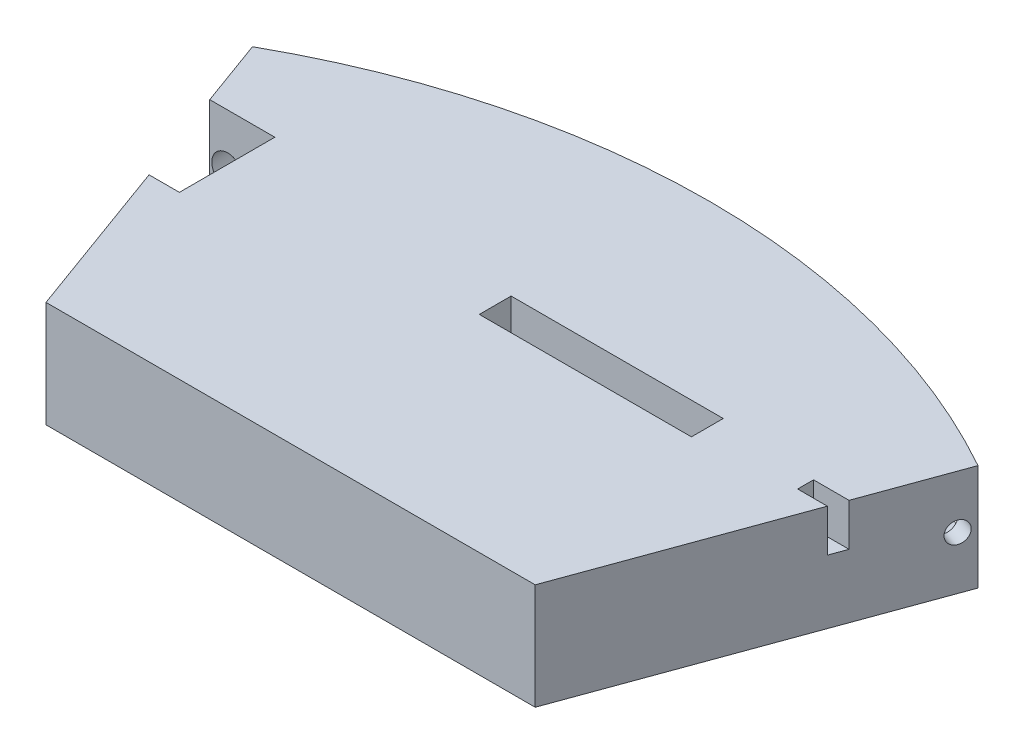
ISO-10303-21;
HEADER;
FILE_DESCRIPTION(('STEP AP214'),'2;1');
FILE_NAME('part.step','',(''),(''),'','','');
FILE_SCHEMA(('AUTOMOTIVE_DESIGN { 1 0 10303 214 1 1 1 1 }'));
ENDSEC;
DATA;
#1=APPLICATION_CONTEXT('core data for automotive mechanical design processes');
#2=APPLICATION_PROTOCOL_DEFINITION('international standard','automotive_design',2000,#1);
#3=PRODUCT_CONTEXT('',#1,'mechanical');
#4=PRODUCT('Part','Part','',(#3));
#5=PRODUCT_RELATED_PRODUCT_CATEGORY('part','',(#4));
#6=PRODUCT_DEFINITION_FORMATION('','',#4);
#7=PRODUCT_DEFINITION_CONTEXT('part definition',#1,'design');
#8=PRODUCT_DEFINITION('design','',#6,#7);
#9=PRODUCT_DEFINITION_SHAPE('','',#8);
#10=(LENGTH_UNIT() NAMED_UNIT(*) SI_UNIT(.MILLI.,.METRE.));
#11=(NAMED_UNIT(*) PLANE_ANGLE_UNIT() SI_UNIT($,.RADIAN.));
#12=(NAMED_UNIT(*) SI_UNIT($,.STERADIAN.) SOLID_ANGLE_UNIT());
#13=UNCERTAINTY_MEASURE_WITH_UNIT(LENGTH_MEASURE(1.E-05),#10,'distance_accuracy_value','');
#14=(GEOMETRIC_REPRESENTATION_CONTEXT(3) GLOBAL_UNCERTAINTY_ASSIGNED_CONTEXT((#13)) GLOBAL_UNIT_ASSIGNED_CONTEXT((#10,
#11,#12)) REPRESENTATION_CONTEXT('',''));
#15=CARTESIAN_POINT('',(0.,0.,0.));
#16=DIRECTION('',(0.,0.,1.));
#17=DIRECTION('',(1.,0.,0.));
#18=AXIS2_PLACEMENT_3D('',#15,#16,#17);
#19=CARTESIAN_POINT('',(-10.5718368385246,48.,3.84783393074178));
#20=DIRECTION('',(0.939692620785911,0.,-0.342020143325663));
#21=DIRECTION('',(-0.342020143325663,0.,-0.939692620785911));
#22=AXIS2_PLACEMENT_3D('',#19,#20,#21);
#23=PLANE('',#22);
#24=DIRECTION('',(0.,-1.,0.));
#25=VECTOR('',#24,1.);
#26=CARTESIAN_POINT('',(-23.0613730998364,48.,-30.4668849266728));
#27=LINE('',#26,#25);
#28=CARTESIAN_POINT('',(-23.0613730998364,10.,-30.4668849266728));
#29=VERTEX_POINT('',#28);
#30=CARTESIAN_POINT('',(-23.0613730998364,0.,-30.4668849266728));
#31=VERTEX_POINT('',#30);
#32=EDGE_CURVE('E54',#29,#31,#27,.T.);
#33=ORIENTED_EDGE('',*,*,#32,.F.);
#34=DIRECTION('',(-0.342020143325663,0.,-0.939692620785911));
#35=VECTOR('',#34,1.);
#36=CARTESIAN_POINT('',(-10.5718368385246,10.,3.84783393074178));
#37=LINE('',#36,#35);
#38=CARTESIAN_POINT('',(-28.6203658303528,10.,-45.7400919286794));
#39=VERTEX_POINT('',#38);
#40=EDGE_CURVE('E209',#29,#39,#37,.T.);
#41=ORIENTED_EDGE('',*,*,#40,.T.);
#42=DIRECTION('',(0.,-1.,0.));
#43=VECTOR('',#42,1.);
#44=CARTESIAN_POINT('',(-28.6203658303528,48.,-45.7400919286794));
#45=LINE('',#44,#43);
#46=CARTESIAN_POINT('',(-28.6203658303528,0.,-45.7400919286794));
#47=VERTEX_POINT('',#46);
#48=EDGE_CURVE('E200',#39,#47,#45,.T.);
#49=ORIENTED_EDGE('',*,*,#48,.T.);
#50=DIRECTION('',(0.342020143325663,0.,0.939692620785911));
#51=VECTOR('',#50,1.);
#52=CARTESIAN_POINT('',(-10.5718368385246,0.,3.84783393074178));
#53=LINE('',#52,#51);
#54=EDGE_CURVE('E195',#47,#31,#53,.T.);
#55=ORIENTED_EDGE('',*,*,#54,.T.);
#56=EDGE_LOOP('',(#33,#41,#49,#55));
#57=FACE_BOUND('',#56,.T.);
#58=ADVANCED_FACE('F43',(#57),#23,.F.);
#59=CARTESIAN_POINT('',(10.5718368385246,48.,3.84783393074178));
#60=DIRECTION('',(0.939692620785911,0.,0.342020143325663));
#61=DIRECTION('',(0.342020143325663,0.,-0.939692620785911));
#62=AXIS2_PLACEMENT_3D('',#59,#60,#61);
#63=PLANE('',#62);
#64=CARTESIAN_POINT('',(33.6889841175779,5.,-59.6660062206653));
#65=DIRECTION('',(0.939692620785911,0.,0.342020143325663));
#66=DIRECTION('',(0.342020143325663,0.,-0.939692620785911));
#67=AXIS2_PLACEMENT_3D('',#64,#65,#66);
#68=CIRCLE('',#67,0.999999999999989);
#69=CARTESIAN_POINT('',(34.0310042609035,5.,-60.6056988414512));
#70=VERTEX_POINT('',#69);
#71=EDGE_CURVE('E325',#70,#70,#68,.T.);
#72=ORIENTED_EDGE('',*,*,#71,.F.);
#73=EDGE_LOOP('',(#72));
#74=FACE_BOUND('',#73,.T.);
#75=DIRECTION('',(0.342020143325663,0.,-0.939692620785911));
#76=VECTOR('',#75,1.);
#77=CARTESIAN_POINT('',(10.5718368385246,10.,3.84783393074178));
#78=LINE('',#77,#76);
#79=CARTESIAN_POINT('',(23.0613730998364,10.,-30.4668849266728));
#80=VERTEX_POINT('',#79);
#81=CARTESIAN_POINT('',(30.4116284354436,10.,-50.6615454884798));
#82=VERTEX_POINT('',#81);
#83=EDGE_CURVE('E245',#80,#82,#78,.T.);
#84=ORIENTED_EDGE('',*,*,#83,.F.);
#85=DIRECTION('',(0.,-1.,0.));
#86=VECTOR('',#85,1.);
#87=CARTESIAN_POINT('',(23.0613730998364,48.,-30.4668849266728));
#88=LINE('',#87,#86);
#89=CARTESIAN_POINT('',(23.0613730998364,0.,-30.4668849266728));
#90=VERTEX_POINT('',#89);
#91=EDGE_CURVE('E202',#80,#90,#88,.T.);
#92=ORIENTED_EDGE('',*,*,#91,.T.);
#93=DIRECTION('',(-0.342020143325663,0.,0.939692620785911));
#94=VECTOR('',#93,1.);
#95=CARTESIAN_POINT('',(10.5718368385246,0.,3.84783393074178));
#96=LINE('',#95,#94);
#97=CARTESIAN_POINT('',(34.2020143325663,0.,-61.075545151844));
#98=VERTEX_POINT('',#97);
#99=EDGE_CURVE('E198',#98,#90,#96,.T.);
#100=ORIENTED_EDGE('',*,*,#99,.F.);
#101=DIRECTION('',(0.,-1.,0.));
#102=VECTOR('',#101,1.);
#103=CARTESIAN_POINT('',(34.2020143325663,48.,-61.075545151844));
#104=LINE('',#103,#102);
#105=CARTESIAN_POINT('',(34.2020143325663,10.,-61.075545151844));
#106=VERTEX_POINT('',#105);
#107=EDGE_CURVE('E225',#106,#98,#104,.T.);
#108=ORIENTED_EDGE('',*,*,#107,.F.);
#109=CARTESIAN_POINT('',(30.9575837868429,10.,-52.1615454884798));
#110=VERTEX_POINT('',#109);
#111=EDGE_CURVE('E288',#110,#106,#78,.T.);
#112=ORIENTED_EDGE('',*,*,#111,.F.);
#113=DIRECTION('',(0.,1.,0.));
#114=VECTOR('',#113,1.);
#115=CARTESIAN_POINT('',(30.9575837868429,48.,-52.1615454884798));
#116=LINE('',#115,#114);
#117=CARTESIAN_POINT('',(30.9575837868429,6.,-52.1615454884798));
#118=VERTEX_POINT('',#117);
#119=EDGE_CURVE('E427',#118,#110,#116,.T.);
#120=ORIENTED_EDGE('',*,*,#119,.F.);
#121=DIRECTION('',(-0.342020143325663,0.,0.939692620785911));
#122=VECTOR('',#121,1.);
#123=CARTESIAN_POINT('',(10.5718368385246,6.,3.84783393074178));
#124=LINE('',#123,#122);
#125=CARTESIAN_POINT('',(30.4116284354436,6.,-50.6615454884798));
#126=VERTEX_POINT('',#125);
#127=EDGE_CURVE('E207',#118,#126,#124,.T.);
#128=ORIENTED_EDGE('',*,*,#127,.T.);
#129=DIRECTION('',(0.,-1.,0.));
#130=VECTOR('',#129,1.);
#131=CARTESIAN_POINT('',(30.4116284354436,48.,-50.6615454884798));
#132=LINE('',#131,#130);
#133=EDGE_CURVE('E397',#82,#126,#132,.T.);
#134=ORIENTED_EDGE('',*,*,#133,.F.);
#135=EDGE_LOOP('',(#84,#92,#100,#108,#112,#120,#128,#134));
#136=FACE_BOUND('',#135,.T.);
#137=ADVANCED_FACE('F383',(#74,#136),#63,.T.);
#138=CARTESIAN_POINT('',(0.,0.,0.));
#139=DIRECTION('',(0.,1.,0.));
#140=DIRECTION('',(0.,0.,1.));
#141=AXIS2_PLACEMENT_3D('',#138,#139,#140);
#142=PLANE('',#141);
#143=DIRECTION('',(1.,0.,0.));
#144=VECTOR('',#143,1.);
#145=CARTESIAN_POINT('',(0.,0.,-49.9115454884798));
#146=LINE('',#145,#144);
#147=CARTESIAN_POINT('',(-1.65303602574778,0.,-49.9115454884798));
#148=VERTEX_POINT('',#147);
#149=CARTESIAN_POINT('',(18.3469639742522,0.,-49.9115454884798));
#150=VERTEX_POINT('',#149);
#151=EDGE_CURVE('E486',#148,#150,#146,.T.);
#152=ORIENTED_EDGE('',*,*,#151,.T.);
#153=DIRECTION('',(0.,0.,-1.));
#154=VECTOR('',#153,1.);
#155=CARTESIAN_POINT('',(18.3469639742522,0.,0.));
#156=LINE('',#155,#154);
#157=CARTESIAN_POINT('',(18.3469639742522,0.,-52.9115454884798));
#158=VERTEX_POINT('',#157);
#159=EDGE_CURVE('E482',#150,#158,#156,.T.);
#160=ORIENTED_EDGE('',*,*,#159,.T.);
#161=DIRECTION('',(-1.,0.,0.));
#162=VECTOR('',#161,1.);
#163=CARTESIAN_POINT('',(0.,0.,-52.9115454884798));
#164=LINE('',#163,#162);
#165=CARTESIAN_POINT('',(-1.65303602574778,0.,-52.9115454884798));
#166=VERTEX_POINT('',#165);
#167=EDGE_CURVE('E478',#158,#166,#164,.T.);
#168=ORIENTED_EDGE('',*,*,#167,.T.);
#169=DIRECTION('',(0.,0.,1.));
#170=VECTOR('',#169,1.);
#171=CARTESIAN_POINT('',(-1.65303602574778,0.,0.));
#172=LINE('',#171,#170);
#173=EDGE_CURVE('E304',#166,#148,#172,.T.);
#174=ORIENTED_EDGE('',*,*,#173,.T.);
#175=EDGE_LOOP('',(#152,#160,#168,#174));
#176=FACE_BOUND('',#175,.T.);
#177=DIRECTION('',(1.,0.,0.));
#178=VECTOR('',#177,1.);
#179=CARTESIAN_POINT('',(-51.0427097644278,0.,-30.4668849266728));
#180=LINE('',#179,#178);
#181=EDGE_CURVE('E12',#31,#90,#180,.T.);
#182=ORIENTED_EDGE('',*,*,#181,.F.);
#183=ORIENTED_EDGE('',*,*,#54,.F.);
#184=DIRECTION('',(1.,0.,0.));
#185=VECTOR('',#184,1.);
#186=CARTESIAN_POINT('',(0.,0.,-45.7400919286794));
#187=LINE('',#186,#185);
#188=CARTESIAN_POINT('',(-25.7582318845507,0.,-45.7400919286794));
#189=VERTEX_POINT('',#188);
#190=EDGE_CURVE('E301',#47,#189,#187,.T.);
#191=ORIENTED_EDGE('',*,*,#190,.T.);
#192=DIRECTION('',(0.,0.,-1.));
#193=VECTOR('',#192,1.);
#194=CARTESIAN_POINT('',(-25.7582318845507,0.,0.));
#195=LINE('',#194,#193);
#196=CARTESIAN_POINT('',(-25.7582318845507,0.,-54.7400919286794));
#197=VERTEX_POINT('',#196);
#198=EDGE_CURVE('E298',#189,#197,#195,.T.);
#199=ORIENTED_EDGE('',*,*,#198,.T.);
#200=DIRECTION('',(-1.,0.,0.));
#201=VECTOR('',#200,1.);
#202=CARTESIAN_POINT('',(0.,0.,-54.7400919286794));
#203=LINE('',#202,#201);
#204=CARTESIAN_POINT('',(-31.8960979387486,0.,-54.7400919286794));
#205=VERTEX_POINT('',#204);
#206=EDGE_CURVE('E234',#197,#205,#203,.T.);
#207=ORIENTED_EDGE('',*,*,#206,.T.);
#208=CARTESIAN_POINT('',(-34.2020143325663,0.,-61.075545151844));
#209=VERTEX_POINT('',#208);
#210=EDGE_CURVE('E204',#209,#205,#53,.T.);
#211=ORIENTED_EDGE('',*,*,#210,.F.);
#212=CARTESIAN_POINT('',(0.,0.,0.));
#213=DIRECTION('',(0.,1.,0.));
#214=DIRECTION('',(0.,0.,1.));
#215=AXIS2_PLACEMENT_3D('',#212,#213,#214);
#216=CIRCLE('',#215,70.0000000000001);
#217=EDGE_CURVE('E216',#98,#209,#216,.T.);
#218=ORIENTED_EDGE('',*,*,#217,.F.);
#219=ORIENTED_EDGE('',*,*,#99,.T.);
#220=EDGE_LOOP('',(#182,#183,#191,#199,#207,#211,#218,#219));
#221=FACE_BOUND('',#220,.T.);
#222=ADVANCED_FACE('F193',(#176,#221),#142,.F.);
#223=CARTESIAN_POINT('',(0.,48.,0.));
#224=DIRECTION('',(0.,-1.,0.));
#225=DIRECTION('',(0.,0.,-1.));
#226=AXIS2_PLACEMENT_3D('',#223,#224,#225);
#227=CYLINDRICAL_SURFACE('',#226,70.0000000000001);
#228=CARTESIAN_POINT('',(-29.4520143325663,5.,-63.5025893310999));
#229=CARTESIAN_POINT('',(-29.4520165720181,4.96076542306915,-63.5025883279987));
#230=CARTESIAN_POINT('',(-29.4551087880688,4.92149584425632,-63.5011544302238));
#231=CARTESIAN_POINT('',(-29.4673500500712,4.84408816232103,-63.4954748340918));
#232=CARTESIAN_POINT('',(-29.4765077763565,4.80595176273341,-63.4912251060051));
#233=CARTESIAN_POINT('',(-29.500455192486,4.73200548008909,-63.4801017319065));
#234=CARTESIAN_POINT('',(-29.5152311541268,4.69619017314325,-63.4732344817314));
#235=CARTESIAN_POINT('',(-29.5498229546143,4.62768325802915,-63.4571377036997));
#236=CARTESIAN_POINT('',(-29.5696381320233,4.59499124067818,-63.4479084858694));
#237=CARTESIAN_POINT('',(-29.6144260804573,4.53226097362836,-63.4270163178953));
#238=CARTESIAN_POINT('',(-29.6395628014079,4.50236600696992,-63.4152758378051));
#239=CARTESIAN_POINT('',(-29.6936786849018,4.44719845543255,-63.3899545540359));
#240=CARTESIAN_POINT('',(-29.7226591362495,4.42192742775499,-63.376373133055));
#241=CARTESIAN_POINT('',(-29.7863333521053,4.37436106316963,-63.3464733523005));
#242=CARTESIAN_POINT('',(-29.8213055197328,4.35252396964754,-63.3300192846367));
#243=CARTESIAN_POINT('',(-29.8938293974537,4.31502512864844,-63.2958179754721));
#244=CARTESIAN_POINT('',(-29.9313821589784,4.29936591600043,-63.2780702066876));
#245=CARTESIAN_POINT('',(-30.0116350885681,4.27323019912385,-63.2400498298572));
#246=CARTESIAN_POINT('',(-30.0544925605373,4.26335564018379,-63.2196944874367));
#247=CARTESIAN_POINT('',(-30.1410376744486,4.25120556750364,-63.1784785204468));
#248=CARTESIAN_POINT('',(-30.1847256116581,4.2489328093573,-63.1576177154106));
#249=CARTESIAN_POINT('',(-30.2744939179439,4.25208057725862,-63.1146388657192));
#250=CARTESIAN_POINT('',(-30.3205586878745,4.25797605415926,-63.0925213032177));
#251=CARTESIAN_POINT('',(-30.4111150015853,4.27824502190686,-63.0489223656954));
#252=CARTESIAN_POINT('',(-30.4556062539589,4.29262007449865,-63.0274411086333));
#253=CARTESIAN_POINT('',(-30.541677523567,4.32968316220459,-62.9857779271663));
#254=CARTESIAN_POINT('',(-30.5832567403261,4.35237347245994,-62.9655963601488));
#255=CARTESIAN_POINT('',(-30.6620259112034,4.40573614105573,-62.9272761661936));
#256=CARTESIAN_POINT('',(-30.6992173439776,4.43640579917343,-62.9091368511243));
#257=CARTESIAN_POINT('',(-30.7652828130681,4.50274019633441,-62.8768529356506));
#258=CARTESIAN_POINT('',(-30.7945526295741,4.53791728870649,-62.8625195538163));
#259=CARTESIAN_POINT('',(-30.8465786738135,4.6138038239139,-62.8370068241247));
#260=CARTESIAN_POINT('',(-30.8693405063038,4.65450846152022,-62.8258247624309));
#261=CARTESIAN_POINT('',(-30.9050868121118,4.73554689926589,-62.8082475827299));
#262=CARTESIAN_POINT('',(-30.9188596083154,4.77544965942522,-62.801466945478));
#263=CARTESIAN_POINT('',(-30.9395428577284,4.85740343304919,-62.7912798369741));
#264=CARTESIAN_POINT('',(-30.9464578306779,4.89945301238057,-62.7878711434013));
#265=CARTESIAN_POINT('',(-30.952766548208,4.98053364991135,-62.7847613114896));
#266=CARTESIAN_POINT('',(-30.9527644135155,5.01950760329316,-62.78476237451));
#267=CARTESIAN_POINT('',(-30.9467430433742,5.0968675819089,-62.7877305393539));
#268=CARTESIAN_POINT('',(-30.9407249046188,5.13525371300552,-62.7906971005791));
#269=CARTESIAN_POINT('',(-30.9231494379623,5.20949442961253,-62.7993544618619));
#270=CARTESIAN_POINT('',(-30.911717621466,5.24538623651779,-62.8049835306098));
#271=CARTESIAN_POINT('',(-30.8838392983114,5.31465761599342,-62.8186971389859));
#272=CARTESIAN_POINT('',(-30.8673920611023,5.34803682169217,-62.8267820363317));
#273=CARTESIAN_POINT('',(-30.8292108401578,5.41305108014506,-62.8455267322188));
#274=CARTESIAN_POINT('',(-30.8072663425746,5.4445325415681,-62.8562889000858));
#275=CARTESIAN_POINT('',(-30.7592930479035,5.50337162744063,-62.8797789755196));
#276=CARTESIAN_POINT('',(-30.7332628594155,5.53072784077278,-62.8925075527325));
#277=CARTESIAN_POINT('',(-30.6753606021239,5.58318449681958,-62.9207706492181));
#278=CARTESIAN_POINT('',(-30.643172830987,5.6078554187295,-62.9364549474356));
#279=CARTESIAN_POINT('',(-30.575777706959,5.65147072753192,-62.9692244122883));
#280=CARTESIAN_POINT('',(-30.5405690990712,5.67041271942661,-62.9863101610207));
#281=CARTESIAN_POINT('',(-30.4644001651018,5.70395467526758,-63.0231884507827));
#282=CARTESIAN_POINT('',(-30.423215851626,5.71793680242822,-63.0430813112321));
#283=CARTESIAN_POINT('',(-30.339342159339,5.73858532559017,-63.0834882289172));
#284=CARTESIAN_POINT('',(-30.2966521924204,5.74524882953494,-63.1040025284351));
#285=CARTESIAN_POINT('',(-30.2078231908141,5.75138715298196,-63.146575565457));
#286=CARTESIAN_POINT('',(-30.1616505105743,5.75033062542775,-63.1686426250931));
#287=CARTESIAN_POINT('',(-30.0700444296495,5.73973685205539,-63.2123010516673));
#288=CARTESIAN_POINT('',(-30.0246111800767,5.73019789436595,-63.2338923216833));
#289=CARTESIAN_POINT('',(-29.9354077172029,5.70258104698937,-63.2761710488993));
#290=CARTESIAN_POINT('',(-29.891656318291,5.68442651716003,-63.2968485359135));
#291=CARTESIAN_POINT('',(-29.8077345900449,5.63976592841803,-63.3364122022274));
#292=CARTESIAN_POINT('',(-29.7675632217412,5.61326230270941,-63.3552989013385));
#293=CARTESIAN_POINT('',(-29.6945845205257,5.55415715281234,-63.3895352782556));
#294=CARTESIAN_POINT('',(-29.6614846105688,5.52200050636501,-63.405026866923));
#295=CARTESIAN_POINT('',(-29.6012798751234,5.45140386813743,-63.4331564435902));
#296=CARTESIAN_POINT('',(-29.5741725930129,5.41296646237645,-63.4457956009622));
#297=CARTESIAN_POINT('',(-29.5296151773372,5.33496013880499,-63.4665453153817));
#298=CARTESIAN_POINT('',(-29.5114814036006,5.29586645930463,-63.4749771451344));
#299=CARTESIAN_POINT('',(-29.482111838106,5.21469396947622,-63.4886237665693));
#300=CARTESIAN_POINT('',(-29.4708604957575,5.17262213016533,-63.4938458107696));
#301=CARTESIAN_POINT('',(-29.4595743935174,5.10842886112879,-63.4990826001088));
#302=CARTESIAN_POINT('',(-29.4567442071657,5.08686539965923,-63.5003954711378));
#303=CARTESIAN_POINT('',(-29.4529635764202,5.04353821603679,-63.5021491051687));
#304=CARTESIAN_POINT('',(-29.45201308971,5.02177449840323,-63.5025898878033));
#305=CARTESIAN_POINT('',(-29.4520143325663,5.,-63.5025893310999));
#306=B_SPLINE_CURVE_WITH_KNOTS('',3,(#228,#229,#230,#231,#232,#233,#234,#235,#236,#237,#238,
#239,#240,#241,#242,#243,#244,#245,#246,#247,#248,#249,#250,#251,#252,#253,#254,#255,#256,#257,
#258,#259,#260,#261,#262,#263,#264,#265,#266,#267,#268,#269,#270,#271,#272,#273,#274,#275,#276,
#277,#278,#279,#280,#281,#282,#283,#284,#285,#286,#287,#288,#289,#290,#291,#292,#293,#294,#295,
#296,#297,#298,#299,#300,#301,#302,#303,#304,#305),.UNSPECIFIED.,.T.,.F.,(4,2,2,2,2,2,2,2,2,2,2,
2,2,2,2,2,2,2,2,2,2,2,2,2,2,2,2,2,2,2,2,2,2,2,2,2,2,2,4),(0.,0.117619328729729,
0.235407346877304,0.352909379672008,0.470395997333827,0.592237450480042,0.714119860885319,
0.84673914632988,0.979412789970511,1.12417038486072,1.26898044757111,1.42257311341729,
1.5761940763729,1.72985710304584,1.88346819741346,2.02653065813405,2.16946953798968,
2.2970337576079,2.4245138483395,2.54086051527227,2.65718597654454,2.77093751914448,
2.88470563882239,3.00377134153299,3.12287768092682,3.25278493217147,3.38274641673534,
3.5256114102525,3.66853283858501,3.82137932921715,3.97425667337955,4.12852019019416,
4.28273879101952,4.42797841145977,4.57315838140479,4.70419137917593,4.83492720863318,
4.90020533176597,4.96548198531897),.UNSPECIFIED.);
#307=CARTESIAN_POINT('',(-29.4520143325663,5.,-63.5025893310999));
#308=VERTEX_POINT('',#307);
#309=EDGE_CURVE('E330',#308,#308,#306,.T.);
#310=ORIENTED_EDGE('',*,*,#309,.F.);
#311=EDGE_LOOP('',(#310));
#312=FACE_BOUND('',#311,.T.);
#313=CARTESIAN_POINT('',(0.,8.,0.));
#314=DIRECTION('',(0.,1.,0.));
#315=DIRECTION('',(0.,0.,1.));
#316=AXIS2_PLACEMENT_3D('',#313,#314,#315);
#317=CIRCLE('',#316,70.0000000000001);
#318=CARTESIAN_POINT('',(32.2020143325663,8.,-62.1532804679303));
#319=VERTEX_POINT('',#318);
#320=CARTESIAN_POINT('',(-26.2020143325663,8.,-64.9111272811989));
#321=VERTEX_POINT('',#320);
#322=EDGE_CURVE('E233',#319,#321,#317,.T.);
#323=ORIENTED_EDGE('',*,*,#322,.T.);
#324=DIRECTION('',(0.,-1.,0.));
#325=VECTOR('',#324,1.);
#326=CARTESIAN_POINT('',(-26.2020143325663,48.,-64.9111272811989));
#327=LINE('',#326,#325);
#328=CARTESIAN_POINT('',(-26.2020143325663,2.,-64.9111272811988));
#329=VERTEX_POINT('',#328);
#330=EDGE_CURVE('E271',#321,#329,#327,.T.);
#331=ORIENTED_EDGE('',*,*,#330,.T.);
#332=CARTESIAN_POINT('',(0.,2.,0.));
#333=DIRECTION('',(0.,-1.,0.));
#334=DIRECTION('',(0.,0.,-1.));
#335=AXIS2_PLACEMENT_3D('',#332,#333,#334);
#336=CIRCLE('',#335,70.0000000000001);
#337=CARTESIAN_POINT('',(32.2020143325663,2.,-62.1532804679303));
#338=VERTEX_POINT('',#337);
#339=EDGE_CURVE('E275',#329,#338,#336,.T.);
#340=ORIENTED_EDGE('',*,*,#339,.T.);
#341=DIRECTION('',(0.,-1.,0.));
#342=VECTOR('',#341,1.);
#343=CARTESIAN_POINT('',(32.2020143325663,48.,-62.1532804679303));
#344=LINE('',#343,#342);
#345=EDGE_CURVE('E246',#319,#338,#344,.T.);
#346=ORIENTED_EDGE('',*,*,#345,.F.);
#347=EDGE_LOOP('',(#323,#331,#340,#346));
#348=FACE_BOUND('',#347,.T.);
#349=DIRECTION('',(0.,-1.,0.));
#350=VECTOR('',#349,1.);
#351=CARTESIAN_POINT('',(-34.2020143325663,48.,-61.075545151844));
#352=LINE('',#351,#350);
#353=CARTESIAN_POINT('',(-34.2020143325663,10.,-61.075545151844));
#354=VERTEX_POINT('',#353);
#355=EDGE_CURVE('E267',#354,#209,#352,.T.);
#356=ORIENTED_EDGE('',*,*,#355,.F.);
#357=CARTESIAN_POINT('',(0.,10.,0.));
#358=DIRECTION('',(0.,-1.,0.));
#359=DIRECTION('',(0.,0.,-1.));
#360=AXIS2_PLACEMENT_3D('',#357,#358,#359);
#361=CIRCLE('',#360,70.0000000000001);
#362=EDGE_CURVE('E229',#354,#106,#361,.T.);
#363=ORIENTED_EDGE('',*,*,#362,.T.);
#364=ORIENTED_EDGE('',*,*,#107,.T.);
#365=ORIENTED_EDGE('',*,*,#217,.T.);
#366=EDGE_LOOP('',(#356,#363,#364,#365));
#367=FACE_BOUND('',#366,.T.);
#368=ADVANCED_FACE('F380',(#312,#348,#367),#227,.T.);
#369=ORIENTED_EDGE('',*,*,#210,.T.);
#370=DIRECTION('',(0.,1.,0.));
#371=VECTOR('',#370,1.);
#372=CARTESIAN_POINT('',(-31.8960979387486,48.,-54.7400919286794));
#373=LINE('',#372,#371);
#374=CARTESIAN_POINT('',(-31.8960979387486,10.,-54.7400919286794));
#375=VERTEX_POINT('',#374);
#376=EDGE_CURVE('E215',#205,#375,#373,.T.);
#377=ORIENTED_EDGE('',*,*,#376,.T.);
#378=EDGE_CURVE('E222',#375,#354,#37,.T.);
#379=ORIENTED_EDGE('',*,*,#378,.T.);
#380=ORIENTED_EDGE('',*,*,#355,.T.);
#381=EDGE_LOOP('',(#369,#377,#379,#380));
#382=FACE_BOUND('',#381,.T.);
#383=ADVANCED_FACE('F45',(#382),#23,.F.);
#384=CARTESIAN_POINT('',(0.,48.,3.));
#385=DIRECTION('',(0.,-1.,0.));
#386=DIRECTION('',(0.,0.,-1.));
#387=AXIS2_PLACEMENT_3D('',#384,#385,#386);
#388=CYLINDRICAL_SURFACE('',#387,70.0000000000001);
#389=CARTESIAN_POINT('',(0.,2.,3.));
#390=DIRECTION('',(0.,-1.,0.));
#391=DIRECTION('',(0.,0.,-1.));
#392=AXIS2_PLACEMENT_3D('',#389,#390,#391);
#393=CIRCLE('',#392,70.0000000000001);
#394=CARTESIAN_POINT('',(-26.2020143325663,2.,-61.9111272811988));
#395=VERTEX_POINT('',#394);
#396=CARTESIAN_POINT('',(32.2020143325663,2.,-59.1532804679303));
#397=VERTEX_POINT('',#396);
#398=EDGE_CURVE('E240',#395,#397,#393,.T.);
#399=ORIENTED_EDGE('',*,*,#398,.F.);
#400=DIRECTION('',(0.,-1.,0.));
#401=VECTOR('',#400,1.);
#402=CARTESIAN_POINT('',(-26.2020143325663,48.,-61.9111272811989));
#403=LINE('',#402,#401);
#404=CARTESIAN_POINT('',(-26.2020143325663,8.,-61.9111272811989));
#405=VERTEX_POINT('',#404);
#406=EDGE_CURVE('E256',#405,#395,#403,.T.);
#407=ORIENTED_EDGE('',*,*,#406,.F.);
#408=CARTESIAN_POINT('',(0.,8.,3.));
#409=DIRECTION('',(0.,1.,0.));
#410=DIRECTION('',(0.,0.,1.));
#411=AXIS2_PLACEMENT_3D('',#408,#409,#410);
#412=CIRCLE('',#411,70.0000000000001);
#413=CARTESIAN_POINT('',(32.2020143325663,8.,-59.1532804679303));
#414=VERTEX_POINT('',#413);
#415=EDGE_CURVE('E251',#414,#405,#412,.T.);
#416=ORIENTED_EDGE('',*,*,#415,.F.);
#417=DIRECTION('',(0.,-1.,0.));
#418=VECTOR('',#417,1.);
#419=CARTESIAN_POINT('',(32.2020143325663,48.,-59.1532804679303));
#420=LINE('',#419,#418);
#421=CARTESIAN_POINT('',(32.2020143325663,5.13838703265431,-59.1532804679303));
#422=VERTEX_POINT('',#421);
#423=EDGE_CURVE('E262',#414,#422,#420,.T.);
#424=ORIENTED_EDGE('',*,*,#423,.T.);
#425=CARTESIAN_POINT('',(32.2020143325663,4.8616129673457,-59.1532804679303));
#426=VERTEX_POINT('',#425);
#427=EDGE_CURVE('E266',#422,#426,#420,.T.);
#428=ORIENTED_EDGE('',*,*,#427,.T.);
#429=EDGE_CURVE('E259',#426,#397,#420,.T.);
#430=ORIENTED_EDGE('',*,*,#429,.T.);
#431=EDGE_LOOP('',(#399,#407,#416,#424,#428,#430));
#432=FACE_BOUND('',#431,.T.);
#433=ADVANCED_FACE('F504',(#432),#388,.T.);
#434=CARTESIAN_POINT('',(-26.2020143325663,48.,-64.9111272811989));
#435=DIRECTION('',(-1.,0.,0.));
#436=DIRECTION('',(0.,0.,1.));
#437=AXIS2_PLACEMENT_3D('',#434,#435,#436);
#438=PLANE('',#437);
#439=ORIENTED_EDGE('',*,*,#406,.T.);
#440=DIRECTION('',(0.,0.,1.));
#441=VECTOR('',#440,1.);
#442=CARTESIAN_POINT('',(-26.2020143325663,2.,-64.9111272811988));
#443=LINE('',#442,#441);
#444=EDGE_CURVE('E235',#329,#395,#443,.T.);
#445=ORIENTED_EDGE('',*,*,#444,.F.);
#446=ORIENTED_EDGE('',*,*,#330,.F.);
#447=DIRECTION('',(0.,0.,1.));
#448=VECTOR('',#447,1.);
#449=CARTESIAN_POINT('',(-26.2020143325663,8.,-64.9111272811989));
#450=LINE('',#449,#448);
#451=EDGE_CURVE('E252',#321,#405,#450,.T.);
#452=ORIENTED_EDGE('',*,*,#451,.T.);
#453=EDGE_LOOP('',(#439,#445,#446,#452));
#454=FACE_BOUND('',#453,.T.);
#455=ADVANCED_FACE('F518',(#454),#438,.F.);
#456=CARTESIAN_POINT('',(-26.2020143325663,8.,-64.9111272811989));
#457=DIRECTION('',(0.,1.,0.));
#458=DIRECTION('',(0.,0.,1.));
#459=AXIS2_PLACEMENT_3D('',#456,#457,#458);
#460=PLANE('',#459);
#461=ORIENTED_EDGE('',*,*,#415,.T.);
#462=ORIENTED_EDGE('',*,*,#451,.F.);
#463=ORIENTED_EDGE('',*,*,#322,.F.);
#464=DIRECTION('',(0.,0.,1.));
#465=VECTOR('',#464,1.);
#466=CARTESIAN_POINT('',(32.2020143325663,8.,-62.1532804679303));
#467=LINE('',#466,#465);
#468=EDGE_CURVE('E247',#319,#414,#467,.T.);
#469=ORIENTED_EDGE('',*,*,#468,.T.);
#470=EDGE_LOOP('',(#461,#462,#463,#469));
#471=FACE_BOUND('',#470,.T.);
#472=ADVANCED_FACE('F525',(#471),#460,.F.);
#473=CARTESIAN_POINT('',(32.2020143325663,2.,-62.1532804679303));
#474=DIRECTION('',(0.,-1.,0.));
#475=DIRECTION('',(0.,0.,-1.));
#476=AXIS2_PLACEMENT_3D('',#473,#474,#475);
#477=PLANE('',#476);
#478=ORIENTED_EDGE('',*,*,#398,.T.);
#479=DIRECTION('',(0.,0.,1.));
#480=VECTOR('',#479,1.);
#481=CARTESIAN_POINT('',(32.2020143325663,2.,-62.1532804679303));
#482=LINE('',#481,#480);
#483=EDGE_CURVE('E241',#338,#397,#482,.T.);
#484=ORIENTED_EDGE('',*,*,#483,.F.);
#485=ORIENTED_EDGE('',*,*,#339,.F.);
#486=ORIENTED_EDGE('',*,*,#444,.T.);
#487=EDGE_LOOP('',(#478,#484,#485,#486));
#488=FACE_BOUND('',#487,.T.);
#489=ADVANCED_FACE('F512',(#488),#477,.F.);
#490=CARTESIAN_POINT('',(32.2020143325663,48.,-62.1532804679303));
#491=DIRECTION('',(-1.,0.,0.));
#492=DIRECTION('',(0.,0.,1.));
#493=AXIS2_PLACEMENT_3D('',#490,#491,#492);
#494=PLANE('',#493);
#495=CARTESIAN_POINT('',(32.2020143325663,5.,-60.2072189616627));
#496=DIRECTION('',(-1.,0.,0.));
#497=DIRECTION('',(0.,0.,1.));
#498=AXIS2_PLACEMENT_3D('',#495,#496,#497);
#499=ELLIPSE('',#498,1.0641777724759,0.999999999999989);
#500=EDGE_CURVE('E239',#426,#422,#499,.F.);
#501=ORIENTED_EDGE('',*,*,#500,.T.);
#502=ORIENTED_EDGE('',*,*,#423,.F.);
#503=ORIENTED_EDGE('',*,*,#468,.F.);
#504=ORIENTED_EDGE('',*,*,#345,.T.);
#505=ORIENTED_EDGE('',*,*,#483,.T.);
#506=ORIENTED_EDGE('',*,*,#429,.F.);
#507=EDGE_LOOP('',(#501,#502,#503,#504,#505,#506));
#508=FACE_BOUND('',#507,.T.);
#509=ADVANCED_FACE('F502',(#508),#494,.T.);
#510=CARTESIAN_POINT('',(-34.2020143325663,10.,-70.4668849266728));
#511=DIRECTION('',(0.,-1.,0.));
#512=DIRECTION('',(0.,0.,-1.));
#513=AXIS2_PLACEMENT_3D('',#510,#511,#512);
#514=PLANE('',#513);
#515=DIRECTION('',(-1.,0.,0.));
#516=VECTOR('',#515,1.);
#517=CARTESIAN_POINT('',(-1.65303602574778,10.,-52.9115454884798));
#518=LINE('',#517,#516);
#519=CARTESIAN_POINT('',(18.3469639742522,10.,-52.9115454884798));
#520=VERTEX_POINT('',#519);
#521=CARTESIAN_POINT('',(-1.65303602574778,10.,-52.9115454884798));
#522=VERTEX_POINT('',#521);
#523=EDGE_CURVE('E451',#520,#522,#518,.T.);
#524=ORIENTED_EDGE('',*,*,#523,.F.);
#525=DIRECTION('',(0.,0.,-1.));
#526=VECTOR('',#525,1.);
#527=CARTESIAN_POINT('',(18.3469639742522,10.,-52.9115454884798));
#528=LINE('',#527,#526);
#529=CARTESIAN_POINT('',(18.3469639742522,10.,-49.9115454884798));
#530=VERTEX_POINT('',#529);
#531=EDGE_CURVE('E452',#530,#520,#528,.T.);
#532=ORIENTED_EDGE('',*,*,#531,.F.);
#533=DIRECTION('',(1.,0.,0.));
#534=VECTOR('',#533,1.);
#535=CARTESIAN_POINT('',(-1.65303602574778,10.,-49.9115454884798));
#536=LINE('',#535,#534);
#537=CARTESIAN_POINT('',(-1.65303602574778,10.,-49.9115454884798));
#538=VERTEX_POINT('',#537);
#539=EDGE_CURVE('E465',#538,#530,#536,.T.);
#540=ORIENTED_EDGE('',*,*,#539,.F.);
#541=DIRECTION('',(0.,0.,1.));
#542=VECTOR('',#541,1.);
#543=CARTESIAN_POINT('',(-1.65303602574778,10.,-52.9115454884798));
#544=LINE('',#543,#542);
#545=EDGE_CURVE('E460',#522,#538,#544,.T.);
#546=ORIENTED_EDGE('',*,*,#545,.F.);
#547=EDGE_LOOP('',(#524,#532,#540,#546));
#548=FACE_BOUND('',#547,.T.);
#549=ORIENTED_EDGE('',*,*,#83,.T.);
#550=DIRECTION('',(1.,0.,0.));
#551=VECTOR('',#550,1.);
#552=CARTESIAN_POINT('',(27.6086209510993,10.,-50.6615454884798));
#553=LINE('',#552,#551);
#554=CARTESIAN_POINT('',(27.6086209510993,10.,-50.6615454884798));
#555=VERTEX_POINT('',#554);
#556=EDGE_CURVE('E402',#555,#82,#553,.T.);
#557=ORIENTED_EDGE('',*,*,#556,.F.);
#558=DIRECTION('',(0.,0.,1.));
#559=VECTOR('',#558,1.);
#560=CARTESIAN_POINT('',(27.6086209510993,10.,-52.1615454884798));
#561=LINE('',#560,#559);
#562=CARTESIAN_POINT('',(27.6086209510993,10.,-52.1615454884798));
#563=VERTEX_POINT('',#562);
#564=EDGE_CURVE('E434',#563,#555,#561,.T.);
#565=ORIENTED_EDGE('',*,*,#564,.F.);
#566=DIRECTION('',(1.,0.,0.));
#567=VECTOR('',#566,1.);
#568=CARTESIAN_POINT('',(-34.2020143325663,10.,-52.1615454884798));
#569=LINE('',#568,#567);
#570=EDGE_CURVE('E287',#563,#110,#569,.T.);
#571=ORIENTED_EDGE('',*,*,#570,.T.);
#572=ORIENTED_EDGE('',*,*,#111,.T.);
#573=ORIENTED_EDGE('',*,*,#362,.F.);
#574=ORIENTED_EDGE('',*,*,#378,.F.);
#575=DIRECTION('',(-1.,0.,0.));
#576=VECTOR('',#575,1.);
#577=CARTESIAN_POINT('',(-34.7582318845507,10.,-54.7400919286794));
#578=LINE('',#577,#576);
#579=CARTESIAN_POINT('',(-25.7582318845507,10.,-54.7400919286794));
#580=VERTEX_POINT('',#579);
#581=EDGE_CURVE('E297',#580,#375,#578,.T.);
#582=ORIENTED_EDGE('',*,*,#581,.F.);
#583=DIRECTION('',(0.,0.,-1.));
#584=VECTOR('',#583,1.);
#585=CARTESIAN_POINT('',(-25.7582318845507,10.,-54.7400919286794));
#586=LINE('',#585,#584);
#587=CARTESIAN_POINT('',(-25.7582318845507,10.,-45.7400919286794));
#588=VERTEX_POINT('',#587);
#589=EDGE_CURVE('E313',#588,#580,#586,.T.);
#590=ORIENTED_EDGE('',*,*,#589,.F.);
#591=DIRECTION('',(-1.,0.,0.));
#592=VECTOR('',#591,1.);
#593=CARTESIAN_POINT('',(-34.2020143325663,10.,-45.7400919286794));
#594=LINE('',#593,#592);
#595=EDGE_CURVE('E405',#588,#39,#594,.T.);
#596=ORIENTED_EDGE('',*,*,#595,.T.);
#597=ORIENTED_EDGE('',*,*,#40,.F.);
#598=DIRECTION('',(1.,0.,0.));
#599=VECTOR('',#598,1.);
#600=CARTESIAN_POINT('',(-34.2020143325663,10.,-30.4668849266728));
#601=LINE('',#600,#599);
#602=EDGE_CURVE('E47',#29,#80,#601,.T.);
#603=ORIENTED_EDGE('',*,*,#602,.T.);
#604=EDGE_LOOP('',(#549,#557,#565,#571,#572,#573,#574,#582,#590,#596,#597,#603));
#605=FACE_BOUND('',#604,.T.);
#606=ADVANCED_FACE('F400',(#548,#605),#514,.F.);
#607=CARTESIAN_POINT('',(-25.7582318845507,-1.,-54.7400919286794));
#608=DIRECTION('',(1.,0.,0.));
#609=DIRECTION('',(0.,0.,-1.));
#610=AXIS2_PLACEMENT_3D('',#607,#608,#609);
#611=PLANE('',#610);
#612=DIRECTION('',(0.,1.,0.));
#613=VECTOR('',#612,1.);
#614=CARTESIAN_POINT('',(-25.7582318845507,-1.,-45.7400919286794));
#615=LINE('',#614,#613);
#616=EDGE_CURVE('E314',#189,#588,#615,.T.);
#617=ORIENTED_EDGE('',*,*,#616,.T.);
#618=ORIENTED_EDGE('',*,*,#589,.T.);
#619=DIRECTION('',(0.,1.,0.));
#620=VECTOR('',#619,1.);
#621=CARTESIAN_POINT('',(-25.7582318845507,-1.,-54.7400919286794));
#622=LINE('',#621,#620);
#623=EDGE_CURVE('E309',#197,#580,#622,.T.);
#624=ORIENTED_EDGE('',*,*,#623,.F.);
#625=ORIENTED_EDGE('',*,*,#198,.F.);
#626=EDGE_LOOP('',(#617,#618,#624,#625));
#627=FACE_BOUND('',#626,.T.);
#628=ADVANCED_FACE('F501',(#627),#611,.F.);
#629=CARTESIAN_POINT('',(-34.7582318845507,-1.,-45.7400919286794));
#630=DIRECTION('',(0.,0.,1.));
#631=DIRECTION('',(0.,-1.,0.));
#632=AXIS2_PLACEMENT_3D('',#629,#630,#631);
#633=PLANE('',#632);
#634=ORIENTED_EDGE('',*,*,#595,.F.);
#635=ORIENTED_EDGE('',*,*,#616,.F.);
#636=ORIENTED_EDGE('',*,*,#190,.F.);
#637=ORIENTED_EDGE('',*,*,#48,.F.);
#638=EDGE_LOOP('',(#634,#635,#636,#637));
#639=FACE_BOUND('',#638,.T.);
#640=ADVANCED_FACE('F509',(#639),#633,.F.);
#641=CARTESIAN_POINT('',(-34.7582318845507,-1.,-54.7400919286794));
#642=DIRECTION('',(0.,0.,-1.));
#643=DIRECTION('',(0.,1.,0.));
#644=AXIS2_PLACEMENT_3D('',#641,#642,#643);
#645=PLANE('',#644);
#646=CARTESIAN_POINT('',(-30.2020143325663,5.,-54.7400919286794));
#647=DIRECTION('',(0.,0.,-1.));
#648=DIRECTION('',(0.,1.,0.));
#649=AXIS2_PLACEMENT_3D('',#646,#647,#648);
#650=CIRCLE('',#649,1.5);
#651=CARTESIAN_POINT('',(-30.2020143325663,6.5,-54.7400919286794));
#652=VERTEX_POINT('',#651);
#653=EDGE_CURVE('E296',#652,#652,#650,.F.);
#654=ORIENTED_EDGE('',*,*,#653,.F.);
#655=EDGE_LOOP('',(#654));
#656=FACE_BOUND('',#655,.T.);
#657=ORIENTED_EDGE('',*,*,#206,.F.);
#658=ORIENTED_EDGE('',*,*,#623,.T.);
#659=ORIENTED_EDGE('',*,*,#581,.T.);
#660=ORIENTED_EDGE('',*,*,#376,.F.);
#661=EDGE_LOOP('',(#657,#658,#659,#660));
#662=FACE_BOUND('',#661,.T.);
#663=ADVANCED_FACE('F571',(#656,#662),#645,.F.);
#664=CARTESIAN_POINT('',(-30.2020143325663,5.,-60.));
#665=DIRECTION('',(0.,0.,1.));
#666=DIRECTION('',(1.,0.,0.));
#667=AXIS2_PLACEMENT_3D('',#664,#665,#666);
#668=PLANE('',#667);
#669=CARTESIAN_POINT('',(-30.2020143325663,5.,-60.));
#670=DIRECTION('',(0.,0.,1.));
#671=DIRECTION('',(1.,0.,0.));
#672=AXIS2_PLACEMENT_3D('',#669,#670,#671);
#673=CIRCLE('',#672,0.750000000000002);
#674=CARTESIAN_POINT('',(-29.4520143325663,5.,-60.));
#675=VERTEX_POINT('',#674);
#676=EDGE_CURVE('E329',#675,#675,#673,.T.);
#677=ORIENTED_EDGE('',*,*,#676,.F.);
#678=EDGE_LOOP('',(#677));
#679=FACE_BOUND('',#678,.T.);
#680=CARTESIAN_POINT('',(-30.2020143325663,5.,-60.));
#681=DIRECTION('',(0.,0.,1.));
#682=DIRECTION('',(1.,0.,0.));
#683=AXIS2_PLACEMENT_3D('',#680,#681,#682);
#684=CIRCLE('',#683,1.5);
#685=CARTESIAN_POINT('',(-28.7020143325663,5.,-60.));
#686=VERTEX_POINT('',#685);
#687=EDGE_CURVE('E292',#686,#686,#684,.T.);
#688=ORIENTED_EDGE('',*,*,#687,.T.);
#689=EDGE_LOOP('',(#688));
#690=FACE_BOUND('',#689,.T.);
#691=ADVANCED_FACE('F567',(#679,#690),#668,.T.);
#692=CARTESIAN_POINT('',(-30.2020143325663,5.,-60.));
#693=DIRECTION('',(0.,0.,1.));
#694=DIRECTION('',(1.,0.,0.));
#695=AXIS2_PLACEMENT_3D('',#692,#693,#694);
#696=CYLINDRICAL_SURFACE('',#695,1.5);
#697=ORIENTED_EDGE('',*,*,#653,.T.);
#698=EDGE_LOOP('',(#697));
#699=FACE_BOUND('',#698,.T.);
#700=ORIENTED_EDGE('',*,*,#687,.F.);
#701=EDGE_LOOP('',(#700));
#702=FACE_BOUND('',#701,.T.);
#703=ADVANCED_FACE('F570',(#699,#702),#696,.F.);
#704=CARTESIAN_POINT('',(32.2020143325663,48.,-62.1532804679303));
#705=DIRECTION('',(-1.,0.,0.));
#706=DIRECTION('',(0.,0.,1.));
#707=AXIS2_PLACEMENT_3D('',#704,#705,#706);
#708=PLANE('',#707);
#709=EDGE_CURVE('E324',#422,#426,#499,.F.);
#710=ORIENTED_EDGE('',*,*,#709,.T.);
#711=ORIENTED_EDGE('',*,*,#427,.F.);
#712=EDGE_LOOP('',(#710,#711));
#713=FACE_BOUND('',#712,.T.);
#714=ADVANCED_FACE('F556',(#713),#708,.F.);
#715=CARTESIAN_POINT('',(29.4588747214159,5.,-61.205640128558));
#716=DIRECTION('',(0.93969262078591,0.,0.342020143325663));
#717=DIRECTION('',(0.342020143325663,0.,-0.939692620785911));
#718=AXIS2_PLACEMENT_3D('',#715,#716,#717);
#719=CYLINDRICAL_SURFACE('',#718,0.999999999999989);
#720=ORIENTED_EDGE('',*,*,#71,.T.);
#721=EDGE_LOOP('',(#720));
#722=FACE_BOUND('',#721,.T.);
#723=ORIENTED_EDGE('',*,*,#500,.F.);
#724=ORIENTED_EDGE('',*,*,#709,.F.);
#725=EDGE_LOOP('',(#723,#724));
#726=FACE_BOUND('',#725,.T.);
#727=ADVANCED_FACE('F559',(#722,#726),#719,.F.);
#728=CARTESIAN_POINT('',(-30.2020143325663,5.,-114.729974486288));
#729=DIRECTION('',(0.,0.,1.));
#730=DIRECTION('',(1.,0.,0.));
#731=AXIS2_PLACEMENT_3D('',#728,#729,#730);
#732=CYLINDRICAL_SURFACE('',#731,0.750000000000002);
#733=ORIENTED_EDGE('',*,*,#676,.T.);
#734=EDGE_LOOP('',(#733));
#735=FACE_BOUND('',#734,.T.);
#736=ORIENTED_EDGE('',*,*,#309,.T.);
#737=EDGE_LOOP('',(#736));
#738=FACE_BOUND('',#737,.T.);
#739=ADVANCED_FACE('F341',(#735,#738),#732,.F.);
#740=CARTESIAN_POINT('',(18.3469639742522,-1.,-52.9115454884798));
#741=DIRECTION('',(1.,0.,0.));
#742=DIRECTION('',(0.,0.,-1.));
#743=AXIS2_PLACEMENT_3D('',#740,#741,#742);
#744=PLANE('',#743);
#745=DIRECTION('',(0.,1.,0.));
#746=VECTOR('',#745,1.);
#747=CARTESIAN_POINT('',(18.3469639742522,-1.,-49.9115454884798));
#748=LINE('',#747,#746);
#749=EDGE_CURVE('E339',#150,#530,#748,.T.);
#750=ORIENTED_EDGE('',*,*,#749,.T.);
#751=ORIENTED_EDGE('',*,*,#531,.T.);
#752=DIRECTION('',(0.,1.,0.));
#753=VECTOR('',#752,1.);
#754=CARTESIAN_POINT('',(18.3469639742522,-1.,-52.9115454884798));
#755=LINE('',#754,#753);
#756=EDGE_CURVE('E459',#158,#520,#755,.T.);
#757=ORIENTED_EDGE('',*,*,#756,.F.);
#758=ORIENTED_EDGE('',*,*,#159,.F.);
#759=EDGE_LOOP('',(#750,#751,#757,#758));
#760=FACE_BOUND('',#759,.T.);
#761=ADVANCED_FACE('F346',(#760),#744,.F.);
#762=CARTESIAN_POINT('',(-1.65303602574778,-1.,-49.9115454884798));
#763=DIRECTION('',(0.,0.,1.));
#764=DIRECTION('',(0.,-1.,0.));
#765=AXIS2_PLACEMENT_3D('',#762,#763,#764);
#766=PLANE('',#765);
#767=DIRECTION('',(0.,1.,0.));
#768=VECTOR('',#767,1.);
#769=CARTESIAN_POINT('',(-1.65303602574778,-1.,-49.9115454884798));
#770=LINE('',#769,#768);
#771=EDGE_CURVE('E455',#148,#538,#770,.T.);
#772=ORIENTED_EDGE('',*,*,#771,.T.);
#773=ORIENTED_EDGE('',*,*,#539,.T.);
#774=ORIENTED_EDGE('',*,*,#749,.F.);
#775=ORIENTED_EDGE('',*,*,#151,.F.);
#776=EDGE_LOOP('',(#772,#773,#774,#775));
#777=FACE_BOUND('',#776,.T.);
#778=ADVANCED_FACE('F349',(#777),#766,.F.);
#779=CARTESIAN_POINT('',(-1.65303602574778,-1.,-52.9115454884798));
#780=DIRECTION('',(-1.,0.,0.));
#781=DIRECTION('',(0.,0.,1.));
#782=AXIS2_PLACEMENT_3D('',#779,#780,#781);
#783=PLANE('',#782);
#784=DIRECTION('',(0.,1.,0.));
#785=VECTOR('',#784,1.);
#786=CARTESIAN_POINT('',(-1.65303602574778,-1.,-52.9115454884798));
#787=LINE('',#786,#785);
#788=EDGE_CURVE('E464',#166,#522,#787,.T.);
#789=ORIENTED_EDGE('',*,*,#788,.T.);
#790=ORIENTED_EDGE('',*,*,#545,.T.);
#791=ORIENTED_EDGE('',*,*,#771,.F.);
#792=ORIENTED_EDGE('',*,*,#173,.F.);
#793=EDGE_LOOP('',(#789,#790,#791,#792));
#794=FACE_BOUND('',#793,.T.);
#795=ADVANCED_FACE('F355',(#794),#783,.F.);
#796=CARTESIAN_POINT('',(-1.65303602574778,-1.,-52.9115454884798));
#797=DIRECTION('',(0.,0.,-1.));
#798=DIRECTION('',(-1.,0.,0.));
#799=AXIS2_PLACEMENT_3D('',#796,#797,#798);
#800=PLANE('',#799);
#801=ORIENTED_EDGE('',*,*,#756,.T.);
#802=ORIENTED_EDGE('',*,*,#523,.T.);
#803=ORIENTED_EDGE('',*,*,#788,.F.);
#804=ORIENTED_EDGE('',*,*,#167,.F.);
#805=EDGE_LOOP('',(#801,#802,#803,#804));
#806=FACE_BOUND('',#805,.T.);
#807=ADVANCED_FACE('F351',(#806),#800,.F.);
#808=CARTESIAN_POINT('',(27.6086209510993,6.,-50.6615454884798));
#809=DIRECTION('',(0.,0.,1.));
#810=DIRECTION('',(0.,-1.,0.));
#811=AXIS2_PLACEMENT_3D('',#808,#809,#810);
#812=PLANE('',#811);
#813=ORIENTED_EDGE('',*,*,#133,.T.);
#814=DIRECTION('',(1.,0.,0.));
#815=VECTOR('',#814,1.);
#816=CARTESIAN_POINT('',(27.6086209510993,6.,-50.6615454884798));
#817=LINE('',#816,#815);
#818=CARTESIAN_POINT('',(27.6086209510993,6.,-50.6615454884798));
#819=VERTEX_POINT('',#818);
#820=EDGE_CURVE('E188',#819,#126,#817,.T.);
#821=ORIENTED_EDGE('',*,*,#820,.F.);
#822=DIRECTION('',(0.,1.,0.));
#823=VECTOR('',#822,1.);
#824=CARTESIAN_POINT('',(27.6086209510993,6.,-50.6615454884798));
#825=LINE('',#824,#823);
#826=EDGE_CURVE('E441',#819,#555,#825,.T.);
#827=ORIENTED_EDGE('',*,*,#826,.T.);
#828=ORIENTED_EDGE('',*,*,#556,.T.);
#829=EDGE_LOOP('',(#813,#821,#827,#828));
#830=FACE_BOUND('',#829,.T.);
#831=ADVANCED_FACE('F354',(#830),#812,.F.);
#832=CARTESIAN_POINT('',(27.6086209510993,6.,-52.1615454884798));
#833=DIRECTION('',(-1.,0.,0.));
#834=DIRECTION('',(0.,0.,1.));
#835=AXIS2_PLACEMENT_3D('',#832,#833,#834);
#836=PLANE('',#835);
#837=ORIENTED_EDGE('',*,*,#564,.T.);
#838=ORIENTED_EDGE('',*,*,#826,.F.);
#839=DIRECTION('',(0.,0.,1.));
#840=VECTOR('',#839,1.);
#841=CARTESIAN_POINT('',(27.6086209510993,6.,-52.1615454884798));
#842=LINE('',#841,#840);
#843=CARTESIAN_POINT('',(27.6086209510993,6.,-52.1615454884798));
#844=VERTEX_POINT('',#843);
#845=EDGE_CURVE('E426',#844,#819,#842,.T.);
#846=ORIENTED_EDGE('',*,*,#845,.F.);
#847=DIRECTION('',(0.,1.,0.));
#848=VECTOR('',#847,1.);
#849=CARTESIAN_POINT('',(27.6086209510993,6.,-52.1615454884798));
#850=LINE('',#849,#848);
#851=EDGE_CURVE('E438',#844,#563,#850,.T.);
#852=ORIENTED_EDGE('',*,*,#851,.T.);
#853=EDGE_LOOP('',(#837,#838,#846,#852));
#854=FACE_BOUND('',#853,.T.);
#855=ADVANCED_FACE('F367',(#854),#836,.F.);
#856=CARTESIAN_POINT('',(27.6086209510993,6.,-52.1615454884798));
#857=DIRECTION('',(0.,0.,-1.));
#858=DIRECTION('',(0.,1.,0.));
#859=AXIS2_PLACEMENT_3D('',#856,#857,#858);
#860=PLANE('',#859);
#861=ORIENTED_EDGE('',*,*,#119,.T.);
#862=ORIENTED_EDGE('',*,*,#570,.F.);
#863=ORIENTED_EDGE('',*,*,#851,.F.);
#864=DIRECTION('',(-1.,0.,0.));
#865=VECTOR('',#864,1.);
#866=CARTESIAN_POINT('',(27.6086209510993,6.,-52.1615454884798));
#867=LINE('',#866,#865);
#868=EDGE_CURVE('E423',#118,#844,#867,.T.);
#869=ORIENTED_EDGE('',*,*,#868,.F.);
#870=EDGE_LOOP('',(#861,#862,#863,#869));
#871=FACE_BOUND('',#870,.T.);
#872=ADVANCED_FACE('F363',(#871),#860,.F.);
#873=CARTESIAN_POINT('',(0.,6.,0.));
#874=DIRECTION('',(0.,1.,0.));
#875=DIRECTION('',(0.,0.,1.));
#876=AXIS2_PLACEMENT_3D('',#873,#874,#875);
#877=PLANE('',#876);
#878=ORIENTED_EDGE('',*,*,#868,.T.);
#879=ORIENTED_EDGE('',*,*,#845,.T.);
#880=ORIENTED_EDGE('',*,*,#820,.T.);
#881=ORIENTED_EDGE('',*,*,#127,.F.);
#882=EDGE_LOOP('',(#878,#879,#880,#881));
#883=FACE_BOUND('',#882,.T.);
#884=ADVANCED_FACE('F366',(#883),#877,.T.);
#885=CARTESIAN_POINT('',(-51.0427097644278,0.,-30.4668849266728));
#886=DIRECTION('',(0.,0.,1.));
#887=DIRECTION('',(0.,-1.,0.));
#888=AXIS2_PLACEMENT_3D('',#885,#886,#887);
#889=PLANE('',#888);
#890=ORIENTED_EDGE('',*,*,#32,.T.);
#891=ORIENTED_EDGE('',*,*,#181,.T.);
#892=ORIENTED_EDGE('',*,*,#91,.F.);
#893=ORIENTED_EDGE('',*,*,#602,.F.);
#894=EDGE_LOOP('',(#890,#891,#892,#893));
#895=FACE_BOUND('',#894,.T.);
#896=ADVANCED_FACE('F183',(#895),#889,.T.);
#897=CLOSED_SHELL('',(#58,#137,#222,#368,#383,#433,#455,#472,#489,#509,#606,#628,#640,#663,#691,
#703,#714,#727,#739,#761,#778,#795,#807,#831,#855,#872,#884,#896));
#898=MANIFOLD_SOLID_BREP('B2',#897);
#899=ADVANCED_BREP_SHAPE_REPRESENTATION('',(#18,#898),#14);
#900=SHAPE_DEFINITION_REPRESENTATION(#9,#899);
ENDSEC;
END-ISO-10303-21;
